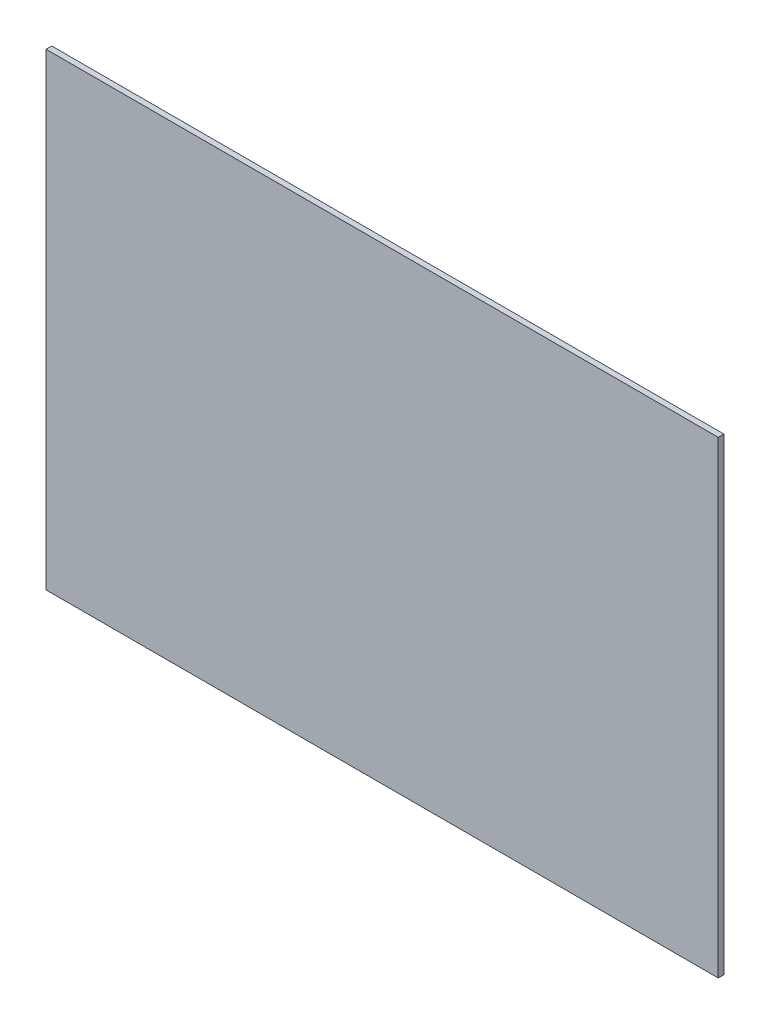
ISO-10303-21;
HEADER;
FILE_DESCRIPTION(('STEP AP214'),'2;1');
FILE_NAME('part.step','',(''),(''),'','','');
FILE_SCHEMA(('AUTOMOTIVE_DESIGN { 1 0 10303 214 1 1 1 1 }'));
ENDSEC;
DATA;
#1=APPLICATION_CONTEXT('core data for automotive mechanical design processes');
#2=APPLICATION_PROTOCOL_DEFINITION('international standard','automotive_design',2000,#1);
#3=PRODUCT_CONTEXT('',#1,'mechanical');
#4=PRODUCT('Part','Part','',(#3));
#5=PRODUCT_RELATED_PRODUCT_CATEGORY('part','',(#4));
#6=PRODUCT_DEFINITION_FORMATION('','',#4);
#7=PRODUCT_DEFINITION_CONTEXT('part definition',#1,'design');
#8=PRODUCT_DEFINITION('design','',#6,#7);
#9=PRODUCT_DEFINITION_SHAPE('','',#8);
#10=(LENGTH_UNIT() NAMED_UNIT(*) SI_UNIT(.MILLI.,.METRE.));
#11=(NAMED_UNIT(*) PLANE_ANGLE_UNIT() SI_UNIT($,.RADIAN.));
#12=(NAMED_UNIT(*) SI_UNIT($,.STERADIAN.) SOLID_ANGLE_UNIT());
#13=UNCERTAINTY_MEASURE_WITH_UNIT(LENGTH_MEASURE(1.E-05),#10,'distance_accuracy_value','');
#14=(GEOMETRIC_REPRESENTATION_CONTEXT(3) GLOBAL_UNCERTAINTY_ASSIGNED_CONTEXT((#13)) GLOBAL_UNIT_ASSIGNED_CONTEXT((#10,
#11,#12)) REPRESENTATION_CONTEXT('',''));
#15=CARTESIAN_POINT('',(0.,0.,0.));
#16=DIRECTION('',(0.,0.,1.));
#17=DIRECTION('',(1.,0.,0.));
#18=AXIS2_PLACEMENT_3D('',#15,#16,#17);
#19=CARTESIAN_POINT('',(-168.246575342466,86.5616438356165,3.));
#20=DIRECTION('',(1.,0.,0.));
#21=DIRECTION('',(0.,1.,0.));
#22=AXIS2_PLACEMENT_3D('',#19,#20,#21);
#23=PLANE('',#22);
#24=DIRECTION('',(0.,-1.,0.));
#25=VECTOR('',#24,1.);
#26=CARTESIAN_POINT('',(-168.246575342466,86.5616438356165,0.));
#27=LINE('',#26,#25);
#28=CARTESIAN_POINT('',(-168.246575342466,86.5616438356165,0.));
#29=VERTEX_POINT('',#28);
#30=CARTESIAN_POINT('',(-168.246575342466,-161.438356164384,0.));
#31=VERTEX_POINT('',#30);
#32=EDGE_CURVE('E98',#29,#31,#27,.T.);
#33=ORIENTED_EDGE('',*,*,#32,.T.);
#34=DIRECTION('',(0.,0.,-1.));
#35=VECTOR('',#34,1.);
#36=CARTESIAN_POINT('',(-168.246575342466,-161.438356164384,3.));
#37=LINE('',#36,#35);
#38=CARTESIAN_POINT('',(-168.246575342466,-161.438356164384,3.));
#39=VERTEX_POINT('',#38);
#40=EDGE_CURVE('E11',#39,#31,#37,.T.);
#41=ORIENTED_EDGE('',*,*,#40,.F.);
#42=DIRECTION('',(0.,-1.,0.));
#43=VECTOR('',#42,1.);
#44=CARTESIAN_POINT('',(-168.246575342466,86.5616438356165,3.));
#45=LINE('',#44,#43);
#46=CARTESIAN_POINT('',(-168.246575342466,86.5616438356165,3.));
#47=VERTEX_POINT('',#46);
#48=EDGE_CURVE('E86',#47,#39,#45,.T.);
#49=ORIENTED_EDGE('',*,*,#48,.F.);
#50=DIRECTION('',(0.,0.,-1.));
#51=VECTOR('',#50,1.);
#52=CARTESIAN_POINT('',(-168.246575342466,86.5616438356165,3.));
#53=LINE('',#52,#51);
#54=EDGE_CURVE('E94',#47,#29,#53,.T.);
#55=ORIENTED_EDGE('',*,*,#54,.T.);
#56=EDGE_LOOP('',(#33,#41,#49,#55));
#57=FACE_BOUND('',#56,.T.);
#58=ADVANCED_FACE('F35',(#57),#23,.F.);
#59=CARTESIAN_POINT('',(-168.246575342466,-161.438356164384,3.));
#60=DIRECTION('',(0.,1.,0.));
#61=DIRECTION('',(0.,0.,1.));
#62=AXIS2_PLACEMENT_3D('',#59,#60,#61);
#63=PLANE('',#62);
#64=DIRECTION('',(1.,0.,0.));
#65=VECTOR('',#64,1.);
#66=CARTESIAN_POINT('',(-168.246575342466,-161.438356164384,0.));
#67=LINE('',#66,#65);
#68=CARTESIAN_POINT('',(187.753424657534,-161.438356164384,0.));
#69=VERTEX_POINT('',#68);
#70=EDGE_CURVE('E90',#31,#69,#67,.T.);
#71=ORIENTED_EDGE('',*,*,#70,.T.);
#72=DIRECTION('',(0.,0.,-1.));
#73=VECTOR('',#72,1.);
#74=CARTESIAN_POINT('',(187.753424657534,-161.438356164384,3.));
#75=LINE('',#74,#73);
#76=CARTESIAN_POINT('',(187.753424657534,-161.438356164384,3.));
#77=VERTEX_POINT('',#76);
#78=EDGE_CURVE('E43',#77,#69,#75,.T.);
#79=ORIENTED_EDGE('',*,*,#78,.F.);
#80=DIRECTION('',(1.,0.,0.));
#81=VECTOR('',#80,1.);
#82=CARTESIAN_POINT('',(-168.246575342466,-161.438356164384,3.));
#83=LINE('',#82,#81);
#84=EDGE_CURVE('E81',#39,#77,#83,.T.);
#85=ORIENTED_EDGE('',*,*,#84,.F.);
#86=ORIENTED_EDGE('',*,*,#40,.T.);
#87=EDGE_LOOP('',(#71,#79,#85,#86));
#88=FACE_BOUND('',#87,.T.);
#89=ADVANCED_FACE('F89',(#88),#63,.F.);
#90=CARTESIAN_POINT('',(187.753424657534,86.5616438356165,3.));
#91=DIRECTION('',(-1.,0.,0.));
#92=DIRECTION('',(0.,-1.,0.));
#93=AXIS2_PLACEMENT_3D('',#90,#91,#92);
#94=PLANE('',#93);
#95=DIRECTION('',(0.,1.,0.));
#96=VECTOR('',#95,1.);
#97=CARTESIAN_POINT('',(187.753424657534,86.5616438356165,0.));
#98=LINE('',#97,#96);
#99=CARTESIAN_POINT('',(187.753424657534,86.5616438356165,0.));
#100=VERTEX_POINT('',#99);
#101=EDGE_CURVE('E68',#69,#100,#98,.T.);
#102=ORIENTED_EDGE('',*,*,#101,.T.);
#103=DIRECTION('',(0.,0.,-1.));
#104=VECTOR('',#103,1.);
#105=CARTESIAN_POINT('',(187.753424657534,86.5616438356165,3.));
#106=LINE('',#105,#104);
#107=CARTESIAN_POINT('',(187.753424657534,86.5616438356165,3.));
#108=VERTEX_POINT('',#107);
#109=EDGE_CURVE('E91',#108,#100,#106,.T.);
#110=ORIENTED_EDGE('',*,*,#109,.F.);
#111=DIRECTION('',(0.,1.,0.));
#112=VECTOR('',#111,1.);
#113=CARTESIAN_POINT('',(187.753424657534,86.5616438356165,3.));
#114=LINE('',#113,#112);
#115=EDGE_CURVE('E84',#77,#108,#114,.T.);
#116=ORIENTED_EDGE('',*,*,#115,.F.);
#117=ORIENTED_EDGE('',*,*,#78,.T.);
#118=EDGE_LOOP('',(#102,#110,#116,#117));
#119=FACE_BOUND('',#118,.T.);
#120=ADVANCED_FACE('F92',(#119),#94,.F.);
#121=CARTESIAN_POINT('',(-168.246575342466,86.5616438356165,3.));
#122=DIRECTION('',(0.,-1.,0.));
#123=DIRECTION('',(0.,0.,-1.));
#124=AXIS2_PLACEMENT_3D('',#121,#122,#123);
#125=PLANE('',#124);
#126=DIRECTION('',(-1.,0.,0.));
#127=VECTOR('',#126,1.);
#128=CARTESIAN_POINT('',(-168.246575342466,86.5616438356165,0.));
#129=LINE('',#128,#127);
#130=EDGE_CURVE('E74',#100,#29,#129,.T.);
#131=ORIENTED_EDGE('',*,*,#130,.T.);
#132=ORIENTED_EDGE('',*,*,#54,.F.);
#133=DIRECTION('',(-1.,0.,0.));
#134=VECTOR('',#133,1.);
#135=CARTESIAN_POINT('',(-168.246575342466,86.5616438356165,3.));
#136=LINE('',#135,#134);
#137=EDGE_CURVE('E51',#108,#47,#136,.T.);
#138=ORIENTED_EDGE('',*,*,#137,.F.);
#139=ORIENTED_EDGE('',*,*,#109,.T.);
#140=EDGE_LOOP('',(#131,#132,#138,#139));
#141=FACE_BOUND('',#140,.T.);
#142=ADVANCED_FACE('F105',(#141),#125,.F.);
#143=CARTESIAN_POINT('',(0.,0.,3.));
#144=DIRECTION('',(0.,0.,1.));
#145=DIRECTION('',(1.,0.,0.));
#146=AXIS2_PLACEMENT_3D('',#143,#144,#145);
#147=PLANE('',#146);
#148=ORIENTED_EDGE('',*,*,#48,.T.);
#149=ORIENTED_EDGE('',*,*,#84,.T.);
#150=ORIENTED_EDGE('',*,*,#115,.T.);
#151=ORIENTED_EDGE('',*,*,#137,.T.);
#152=EDGE_LOOP('',(#148,#149,#150,#151));
#153=FACE_BOUND('',#152,.T.);
#154=ADVANCED_FACE('F82',(#153),#147,.T.);
#155=CARTESIAN_POINT('',(0.,0.,0.));
#156=DIRECTION('',(0.,0.,1.));
#157=DIRECTION('',(1.,0.,0.));
#158=AXIS2_PLACEMENT_3D('',#155,#156,#157);
#159=PLANE('',#158);
#160=ORIENTED_EDGE('',*,*,#32,.F.);
#161=ORIENTED_EDGE('',*,*,#130,.F.);
#162=ORIENTED_EDGE('',*,*,#101,.F.);
#163=ORIENTED_EDGE('',*,*,#70,.F.);
#164=EDGE_LOOP('',(#160,#161,#162,#163));
#165=FACE_BOUND('',#164,.T.);
#166=ADVANCED_FACE('F108',(#165),#159,.F.);
#167=CLOSED_SHELL('',(#58,#89,#120,#142,#154,#166));
#168=MANIFOLD_SOLID_BREP('B2',#167);
#169=ADVANCED_BREP_SHAPE_REPRESENTATION('',(#18,#168),#14);
#170=SHAPE_DEFINITION_REPRESENTATION(#9,#169);
ENDSEC;
END-ISO-10303-21;
